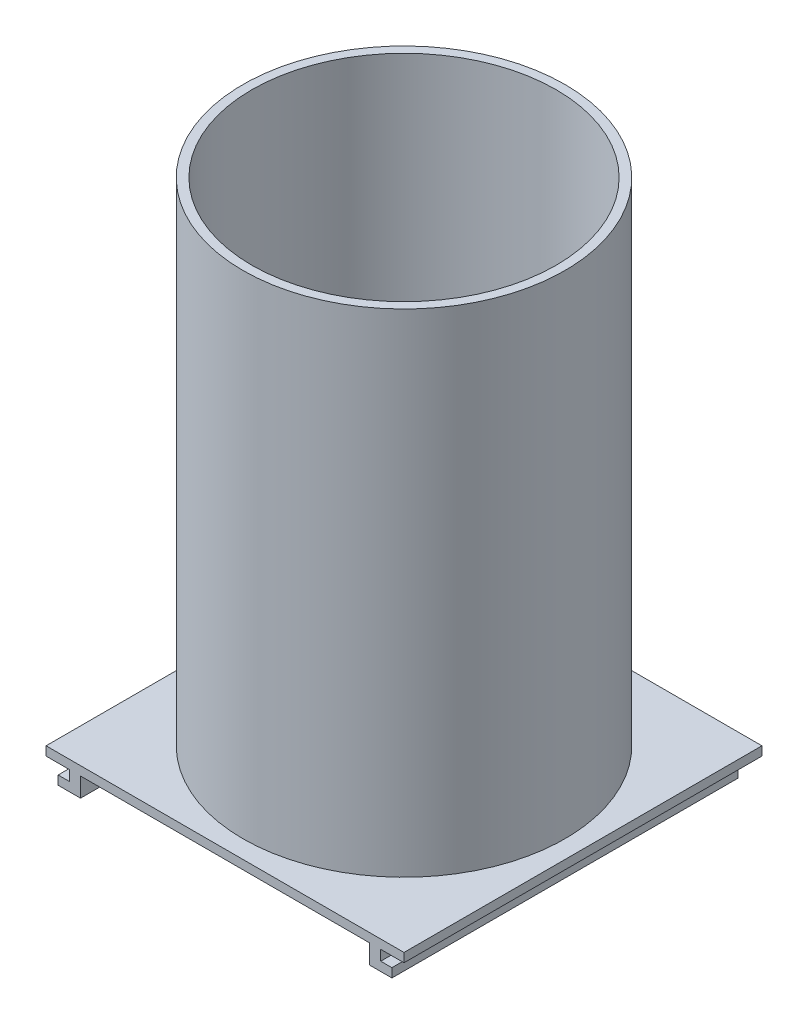
ISO-10303-21;
HEADER;
FILE_DESCRIPTION(('STEP AP214'),'2;1');
FILE_NAME('part.step','',(''),(''),'','','');
FILE_SCHEMA(('AUTOMOTIVE_DESIGN { 1 0 10303 214 1 1 1 1 }'));
ENDSEC;
DATA;
#1=APPLICATION_CONTEXT('core data for automotive mechanical design processes');
#2=APPLICATION_PROTOCOL_DEFINITION('international standard','automotive_design',2000,#1);
#3=PRODUCT_CONTEXT('',#1,'mechanical');
#4=PRODUCT('Part','Part','',(#3));
#5=PRODUCT_RELATED_PRODUCT_CATEGORY('part','',(#4));
#6=PRODUCT_DEFINITION_FORMATION('','',#4);
#7=PRODUCT_DEFINITION_CONTEXT('part definition',#1,'design');
#8=PRODUCT_DEFINITION('design','',#6,#7);
#9=PRODUCT_DEFINITION_SHAPE('','',#8);
#10=(LENGTH_UNIT() NAMED_UNIT(*) SI_UNIT(.MILLI.,.METRE.));
#11=(NAMED_UNIT(*) PLANE_ANGLE_UNIT() SI_UNIT($,.RADIAN.));
#12=(NAMED_UNIT(*) SI_UNIT($,.STERADIAN.) SOLID_ANGLE_UNIT());
#13=UNCERTAINTY_MEASURE_WITH_UNIT(LENGTH_MEASURE(1.E-05),#10,'distance_accuracy_value','');
#14=(GEOMETRIC_REPRESENTATION_CONTEXT(3) GLOBAL_UNCERTAINTY_ASSIGNED_CONTEXT((#13)) GLOBAL_UNIT_ASSIGNED_CONTEXT((#10,
#11,#12)) REPRESENTATION_CONTEXT('',''));
#15=CARTESIAN_POINT('',(0.,0.,0.));
#16=DIRECTION('',(0.,0.,1.));
#17=DIRECTION('',(1.,0.,0.));
#18=AXIS2_PLACEMENT_3D('',#15,#16,#17);
#19=CARTESIAN_POINT('',(0.,-2.,0.));
#20=DIRECTION('',(0.,1.,0.));
#21=DIRECTION('',(0.,0.,1.));
#22=AXIS2_PLACEMENT_3D('',#19,#20,#21);
#23=PLANE('',#22);
#24=CARTESIAN_POINT('',(0.,-2.,0.));
#25=DIRECTION('',(0.,1.,0.));
#26=DIRECTION('',(0.,0.,1.));
#27=AXIS2_PLACEMENT_3D('',#24,#25,#26);
#28=CIRCLE('',#27,34.);
#29=CARTESIAN_POINT('',(-32.3,-2.,10.6164965972773));
#30=VERTEX_POINT('',#29);
#31=CARTESIAN_POINT('',(32.3,-2.,10.6164965972773));
#32=VERTEX_POINT('',#31);
#33=EDGE_CURVE('E284',#30,#32,#28,.T.);
#34=ORIENTED_EDGE('',*,*,#33,.T.);
#35=DIRECTION('',(0.,0.,1.));
#36=VECTOR('',#35,1.);
#37=CARTESIAN_POINT('',(32.3,-1.99999999999999,-46.594694837519));
#38=LINE('',#37,#36);
#39=CARTESIAN_POINT('',(32.3,-2.,40.));
#40=VERTEX_POINT('',#39);
#41=EDGE_CURVE('E181',#32,#40,#38,.T.);
#42=ORIENTED_EDGE('',*,*,#41,.T.);
#43=DIRECTION('',(1.,0.,0.));
#44=VECTOR('',#43,1.);
#45=CARTESIAN_POINT('',(0.,-2.,40.));
#46=LINE('',#45,#44);
#47=CARTESIAN_POINT('',(-32.3,-2.,40.));
#48=VERTEX_POINT('',#47);
#49=EDGE_CURVE('E273',#48,#40,#46,.T.);
#50=ORIENTED_EDGE('',*,*,#49,.F.);
#51=DIRECTION('',(0.,0.,1.));
#52=VECTOR('',#51,1.);
#53=CARTESIAN_POINT('',(-32.3,-2.,-46.594694837519));
#54=LINE('',#53,#52);
#55=EDGE_CURVE('E12',#30,#48,#54,.T.);
#56=ORIENTED_EDGE('',*,*,#55,.F.);
#57=EDGE_LOOP('',(#34,#42,#50,#56));
#58=FACE_BOUND('',#57,.T.);
#59=ADVANCED_FACE('F37',(#58),#23,.F.);
#60=DIRECTION('',(1.,0.,0.));
#61=VECTOR('',#60,1.);
#62=CARTESIAN_POINT('',(34.8,-1.99999999999999,-37.35));
#63=LINE('',#62,#61);
#64=CARTESIAN_POINT('',(32.3,-2.,-37.35));
#65=VERTEX_POINT('',#64);
#66=CARTESIAN_POINT('',(34.8,-2.,-37.35));
#67=VERTEX_POINT('',#66);
#68=EDGE_CURVE('E60',#65,#67,#63,.T.);
#69=ORIENTED_EDGE('',*,*,#68,.F.);
#70=CARTESIAN_POINT('',(32.3,-1.99999999999999,-10.6164965972773));
#71=VERTEX_POINT('',#70);
#72=EDGE_CURVE('E195',#65,#71,#38,.T.);
#73=ORIENTED_EDGE('',*,*,#72,.T.);
#74=CARTESIAN_POINT('',(-32.3,-2.,-10.6164965972773));
#75=VERTEX_POINT('',#74);
#76=EDGE_CURVE('E281',#71,#75,#28,.T.);
#77=ORIENTED_EDGE('',*,*,#76,.T.);
#78=CARTESIAN_POINT('',(-32.3,-2.,-37.35));
#79=VERTEX_POINT('',#78);
#80=EDGE_CURVE('E48',#79,#75,#54,.T.);
#81=ORIENTED_EDGE('',*,*,#80,.F.);
#82=DIRECTION('',(-1.,0.,0.));
#83=VECTOR('',#82,1.);
#84=CARTESIAN_POINT('',(0.,-2.,-37.35));
#85=LINE('',#84,#83);
#86=CARTESIAN_POINT('',(-34.8,-2.,-37.35));
#87=VERTEX_POINT('',#86);
#88=EDGE_CURVE('E226',#79,#87,#85,.T.);
#89=ORIENTED_EDGE('',*,*,#88,.T.);
#90=DIRECTION('',(0.,0.,1.));
#91=VECTOR('',#90,1.);
#92=CARTESIAN_POINT('',(-34.8,-2.,-46.594694837519));
#93=LINE('',#92,#91);
#94=CARTESIAN_POINT('',(-34.8,-2.,40.));
#95=VERTEX_POINT('',#94);
#96=EDGE_CURVE('E247',#87,#95,#93,.T.);
#97=ORIENTED_EDGE('',*,*,#96,.T.);
#98=CARTESIAN_POINT('',(-40.,-2.,40.));
#99=VERTEX_POINT('',#98);
#100=EDGE_CURVE('E269',#99,#95,#46,.T.);
#101=ORIENTED_EDGE('',*,*,#100,.F.);
#102=DIRECTION('',(0.,0.,-1.));
#103=VECTOR('',#102,1.);
#104=CARTESIAN_POINT('',(-40.,-2.,0.));
#105=LINE('',#104,#103);
#106=CARTESIAN_POINT('',(-40.,-2.,-40.));
#107=VERTEX_POINT('',#106);
#108=EDGE_CURVE('E279',#99,#107,#105,.T.);
#109=ORIENTED_EDGE('',*,*,#108,.T.);
#110=DIRECTION('',(1.,0.,0.));
#111=VECTOR('',#110,1.);
#112=CARTESIAN_POINT('',(0.,-2.,-40.));
#113=LINE('',#112,#111);
#114=CARTESIAN_POINT('',(40.,-2.,-40.));
#115=VERTEX_POINT('',#114);
#116=EDGE_CURVE('E277',#107,#115,#113,.T.);
#117=ORIENTED_EDGE('',*,*,#116,.T.);
#118=DIRECTION('',(0.,0.,-1.));
#119=VECTOR('',#118,1.);
#120=CARTESIAN_POINT('',(40.,-2.,0.));
#121=LINE('',#120,#119);
#122=CARTESIAN_POINT('',(40.,-2.,40.));
#123=VERTEX_POINT('',#122);
#124=EDGE_CURVE('E272',#123,#115,#121,.T.);
#125=ORIENTED_EDGE('',*,*,#124,.F.);
#126=CARTESIAN_POINT('',(34.8,-2.,40.));
#127=VERTEX_POINT('',#126);
#128=EDGE_CURVE('E274',#127,#123,#46,.T.);
#129=ORIENTED_EDGE('',*,*,#128,.F.);
#130=DIRECTION('',(0.,0.,1.));
#131=VECTOR('',#130,1.);
#132=CARTESIAN_POINT('',(34.8,-1.99999999999999,-46.594694837519));
#133=LINE('',#132,#131);
#134=EDGE_CURVE('E56',#67,#127,#133,.T.);
#135=ORIENTED_EDGE('',*,*,#134,.F.);
#136=EDGE_LOOP('',(#69,#73,#77,#81,#89,#97,#101,#109,#117,#125,#129,#135));
#137=FACE_BOUND('',#136,.T.);
#138=ADVANCED_FACE('F318',(#137),#23,.F.);
#139=CARTESIAN_POINT('',(0.,-2.,40.));
#140=DIRECTION('',(0.,0.,1.));
#141=DIRECTION('',(1.,0.,0.));
#142=AXIS2_PLACEMENT_3D('',#139,#140,#141);
#143=PLANE('',#142);
#144=DIRECTION('',(1.,0.,0.));
#145=VECTOR('',#144,1.);
#146=CARTESIAN_POINT('',(0.,0.,40.));
#147=LINE('',#146,#145);
#148=CARTESIAN_POINT('',(-40.,0.,40.));
#149=VERTEX_POINT('',#148);
#150=CARTESIAN_POINT('',(40.,0.,40.));
#151=VERTEX_POINT('',#150);
#152=EDGE_CURVE('E266',#149,#151,#147,.T.);
#153=ORIENTED_EDGE('',*,*,#152,.F.);
#154=DIRECTION('',(0.,1.,0.));
#155=VECTOR('',#154,1.);
#156=CARTESIAN_POINT('',(-40.,-2.,40.));
#157=LINE('',#156,#155);
#158=EDGE_CURVE('E46',#99,#149,#157,.T.);
#159=ORIENTED_EDGE('',*,*,#158,.F.);
#160=ORIENTED_EDGE('',*,*,#100,.T.);
#161=DIRECTION('',(0.,1.,0.));
#162=VECTOR('',#161,1.);
#163=CARTESIAN_POINT('',(-34.8,0.,40.));
#164=LINE('',#163,#162);
#165=CARTESIAN_POINT('',(-34.8,-4.3,40.));
#166=VERTEX_POINT('',#165);
#167=EDGE_CURVE('E210',#166,#95,#164,.T.);
#168=ORIENTED_EDGE('',*,*,#167,.F.);
#169=DIRECTION('',(1.,0.,0.));
#170=VECTOR('',#169,1.);
#171=CARTESIAN_POINT('',(0.,-4.3,40.));
#172=LINE('',#171,#170);
#173=CARTESIAN_POINT('',(-37.3,-4.3,40.));
#174=VERTEX_POINT('',#173);
#175=EDGE_CURVE('E234',#174,#166,#172,.T.);
#176=ORIENTED_EDGE('',*,*,#175,.F.);
#177=DIRECTION('',(0.,1.,0.));
#178=VECTOR('',#177,1.);
#179=CARTESIAN_POINT('',(-37.3,0.,40.));
#180=LINE('',#179,#178);
#181=CARTESIAN_POINT('',(-37.3,-6.3,40.));
#182=VERTEX_POINT('',#181);
#183=EDGE_CURVE('E237',#182,#174,#180,.T.);
#184=ORIENTED_EDGE('',*,*,#183,.F.);
#185=DIRECTION('',(-1.,0.,0.));
#186=VECTOR('',#185,1.);
#187=CARTESIAN_POINT('',(0.,-6.29999999999999,40.));
#188=LINE('',#187,#186);
#189=CARTESIAN_POINT('',(-32.3,-6.3,40.));
#190=VERTEX_POINT('',#189);
#191=EDGE_CURVE('E240',#190,#182,#188,.T.);
#192=ORIENTED_EDGE('',*,*,#191,.F.);
#193=DIRECTION('',(0.,-1.,0.));
#194=VECTOR('',#193,1.);
#195=CARTESIAN_POINT('',(-32.3,0.,40.));
#196=LINE('',#195,#194);
#197=EDGE_CURVE('E243',#48,#190,#196,.T.);
#198=ORIENTED_EDGE('',*,*,#197,.F.);
#199=ORIENTED_EDGE('',*,*,#49,.T.);
#200=DIRECTION('',(0.,-1.,0.));
#201=VECTOR('',#200,1.);
#202=CARTESIAN_POINT('',(32.3,-1.99999999999999,40.));
#203=LINE('',#202,#201);
#204=CARTESIAN_POINT('',(32.3,-6.29999999999999,40.));
#205=VERTEX_POINT('',#204);
#206=EDGE_CURVE('E207',#40,#205,#203,.T.);
#207=ORIENTED_EDGE('',*,*,#206,.T.);
#208=DIRECTION('',(1.,0.,0.));
#209=VECTOR('',#208,1.);
#210=CARTESIAN_POINT('',(32.3,-6.29999999999999,40.));
#211=LINE('',#210,#209);
#212=CARTESIAN_POINT('',(37.3,-6.3,40.));
#213=VERTEX_POINT('',#212);
#214=EDGE_CURVE('E204',#205,#213,#211,.T.);
#215=ORIENTED_EDGE('',*,*,#214,.T.);
#216=DIRECTION('',(0.,1.,0.));
#217=VECTOR('',#216,1.);
#218=CARTESIAN_POINT('',(37.3,-6.3,40.));
#219=LINE('',#218,#217);
#220=CARTESIAN_POINT('',(37.3,-4.3,40.));
#221=VERTEX_POINT('',#220);
#222=EDGE_CURVE('E202',#213,#221,#219,.T.);
#223=ORIENTED_EDGE('',*,*,#222,.T.);
#224=DIRECTION('',(-1.,0.,0.));
#225=VECTOR('',#224,1.);
#226=CARTESIAN_POINT('',(37.3,-4.3,40.));
#227=LINE('',#226,#225);
#228=CARTESIAN_POINT('',(34.8,-4.29999999999999,40.));
#229=VERTEX_POINT('',#228);
#230=EDGE_CURVE('E185',#221,#229,#227,.T.);
#231=ORIENTED_EDGE('',*,*,#230,.T.);
#232=DIRECTION('',(0.,1.,0.));
#233=VECTOR('',#232,1.);
#234=CARTESIAN_POINT('',(34.8,-4.29999999999999,40.));
#235=LINE('',#234,#233);
#236=EDGE_CURVE('E198',#229,#127,#235,.T.);
#237=ORIENTED_EDGE('',*,*,#236,.T.);
#238=ORIENTED_EDGE('',*,*,#128,.T.);
#239=DIRECTION('',(0.,1.,0.));
#240=VECTOR('',#239,1.);
#241=CARTESIAN_POINT('',(40.,-2.,40.));
#242=LINE('',#241,#240);
#243=EDGE_CURVE('E41',#123,#151,#242,.T.);
#244=ORIENTED_EDGE('',*,*,#243,.T.);
#245=EDGE_LOOP('',(#153,#159,#160,#168,#176,#184,#192,#198,#199,#207,#215,#223,#231,#237,#238,#244));
#246=FACE_BOUND('',#245,.T.);
#247=ADVANCED_FACE('F39',(#246),#143,.T.);
#248=CARTESIAN_POINT('',(-40.,-2.,0.));
#249=DIRECTION('',(1.,0.,0.));
#250=DIRECTION('',(0.,0.,-1.));
#251=AXIS2_PLACEMENT_3D('',#248,#249,#250);
#252=PLANE('',#251);
#253=DIRECTION('',(0.,0.,-1.));
#254=VECTOR('',#253,1.);
#255=CARTESIAN_POINT('',(-40.,0.,0.));
#256=LINE('',#255,#254);
#257=CARTESIAN_POINT('',(-40.,0.,-40.));
#258=VERTEX_POINT('',#257);
#259=EDGE_CURVE('E293',#149,#258,#256,.T.);
#260=ORIENTED_EDGE('',*,*,#259,.T.);
#261=DIRECTION('',(0.,1.,0.));
#262=VECTOR('',#261,1.);
#263=CARTESIAN_POINT('',(-40.,-2.,-40.));
#264=LINE('',#263,#262);
#265=EDGE_CURVE('E296',#107,#258,#264,.T.);
#266=ORIENTED_EDGE('',*,*,#265,.F.);
#267=ORIENTED_EDGE('',*,*,#108,.F.);
#268=ORIENTED_EDGE('',*,*,#158,.T.);
#269=EDGE_LOOP('',(#260,#266,#267,#268));
#270=FACE_BOUND('',#269,.T.);
#271=ADVANCED_FACE('F313',(#270),#252,.F.);
#272=CARTESIAN_POINT('',(0.,-2.,-40.));
#273=DIRECTION('',(0.,0.,1.));
#274=DIRECTION('',(1.,0.,0.));
#275=AXIS2_PLACEMENT_3D('',#272,#273,#274);
#276=PLANE('',#275);
#277=DIRECTION('',(1.,0.,0.));
#278=VECTOR('',#277,1.);
#279=CARTESIAN_POINT('',(0.,0.,-40.));
#280=LINE('',#279,#278);
#281=CARTESIAN_POINT('',(40.,0.,-40.));
#282=VERTEX_POINT('',#281);
#283=EDGE_CURVE('E290',#258,#282,#280,.T.);
#284=ORIENTED_EDGE('',*,*,#283,.T.);
#285=DIRECTION('',(0.,1.,0.));
#286=VECTOR('',#285,1.);
#287=CARTESIAN_POINT('',(40.,-2.,-40.));
#288=LINE('',#287,#286);
#289=EDGE_CURVE('E298',#115,#282,#288,.T.);
#290=ORIENTED_EDGE('',*,*,#289,.F.);
#291=ORIENTED_EDGE('',*,*,#116,.F.);
#292=ORIENTED_EDGE('',*,*,#265,.T.);
#293=EDGE_LOOP('',(#284,#290,#291,#292));
#294=FACE_BOUND('',#293,.T.);
#295=ADVANCED_FACE('F317',(#294),#276,.F.);
#296=CARTESIAN_POINT('',(40.,-2.,0.));
#297=DIRECTION('',(1.,0.,0.));
#298=DIRECTION('',(0.,0.,-1.));
#299=AXIS2_PLACEMENT_3D('',#296,#297,#298);
#300=PLANE('',#299);
#301=DIRECTION('',(0.,0.,-1.));
#302=VECTOR('',#301,1.);
#303=CARTESIAN_POINT('',(40.,0.,0.));
#304=LINE('',#303,#302);
#305=EDGE_CURVE('E287',#151,#282,#304,.T.);
#306=ORIENTED_EDGE('',*,*,#305,.F.);
#307=ORIENTED_EDGE('',*,*,#243,.F.);
#308=ORIENTED_EDGE('',*,*,#124,.T.);
#309=ORIENTED_EDGE('',*,*,#289,.T.);
#310=EDGE_LOOP('',(#306,#307,#308,#309));
#311=FACE_BOUND('',#310,.T.);
#312=ADVANCED_FACE('F306',(#311),#300,.T.);
#313=CARTESIAN_POINT('',(0.,-2.,0.));
#314=DIRECTION('',(0.,1.,0.));
#315=DIRECTION('',(0.,0.,1.));
#316=AXIS2_PLACEMENT_3D('',#313,#314,#315);
#317=CYLINDRICAL_SURFACE('',#316,34.);
#318=EDGE_CURVE('E282',#75,#30,#28,.T.);
#319=ORIENTED_EDGE('',*,*,#318,.F.);
#320=ORIENTED_EDGE('',*,*,#76,.F.);
#321=EDGE_CURVE('E354',#32,#71,#28,.T.);
#322=ORIENTED_EDGE('',*,*,#321,.F.);
#323=ORIENTED_EDGE('',*,*,#33,.F.);
#324=EDGE_LOOP('',(#319,#320,#322,#323));
#325=FACE_BOUND('',#324,.T.);
#326=CARTESIAN_POINT('',(0.,110.,0.));
#327=DIRECTION('',(0.,1.,0.));
#328=DIRECTION('',(0.,0.,1.));
#329=AXIS2_PLACEMENT_3D('',#326,#327,#328);
#330=CIRCLE('',#329,34.);
#331=CARTESIAN_POINT('',(0.,110.,34.));
#332=VERTEX_POINT('',#331);
#333=EDGE_CURVE('E260',#332,#332,#330,.T.);
#334=ORIENTED_EDGE('',*,*,#333,.T.);
#335=EDGE_LOOP('',(#334));
#336=FACE_BOUND('',#335,.T.);
#337=ADVANCED_FACE('F351',(#325,#336),#317,.F.);
#338=CARTESIAN_POINT('',(0.,0.,0.));
#339=DIRECTION('',(0.,1.,0.));
#340=DIRECTION('',(0.,0.,1.));
#341=AXIS2_PLACEMENT_3D('',#338,#339,#340);
#342=PLANE('',#341);
#343=CARTESIAN_POINT('',(0.,0.,0.));
#344=DIRECTION('',(0.,1.,0.));
#345=DIRECTION('',(0.,0.,1.));
#346=AXIS2_PLACEMENT_3D('',#343,#344,#345);
#347=CIRCLE('',#346,36.);
#348=CARTESIAN_POINT('',(0.,0.,36.));
#349=VERTEX_POINT('',#348);
#350=EDGE_CURVE('E232',#349,#349,#347,.T.);
#351=ORIENTED_EDGE('',*,*,#350,.F.);
#352=EDGE_LOOP('',(#351));
#353=FACE_BOUND('',#352,.T.);
#354=ORIENTED_EDGE('',*,*,#152,.T.);
#355=ORIENTED_EDGE('',*,*,#305,.T.);
#356=ORIENTED_EDGE('',*,*,#283,.F.);
#357=ORIENTED_EDGE('',*,*,#259,.F.);
#358=EDGE_LOOP('',(#354,#355,#356,#357));
#359=FACE_BOUND('',#358,.T.);
#360=ADVANCED_FACE('F310',(#353,#359),#342,.T.);
#361=CARTESIAN_POINT('',(0.,110.,0.));
#362=DIRECTION('',(0.,-1.,0.));
#363=DIRECTION('',(0.,0.,-1.));
#364=AXIS2_PLACEMENT_3D('',#361,#362,#363);
#365=CYLINDRICAL_SURFACE('',#364,36.);
#366=CARTESIAN_POINT('',(0.,110.,0.));
#367=DIRECTION('',(0.,1.,0.));
#368=DIRECTION('',(0.,0.,1.));
#369=AXIS2_PLACEMENT_3D('',#366,#367,#368);
#370=CIRCLE('',#369,36.);
#371=CARTESIAN_POINT('',(0.,110.,36.));
#372=VERTEX_POINT('',#371);
#373=EDGE_CURVE('E263',#372,#372,#370,.T.);
#374=ORIENTED_EDGE('',*,*,#373,.F.);
#375=EDGE_LOOP('',(#374));
#376=FACE_BOUND('',#375,.T.);
#377=ORIENTED_EDGE('',*,*,#350,.T.);
#378=EDGE_LOOP('',(#377));
#379=FACE_BOUND('',#378,.T.);
#380=ADVANCED_FACE('F383',(#376,#379),#365,.T.);
#381=CARTESIAN_POINT('',(0.,110.,0.));
#382=DIRECTION('',(0.,1.,0.));
#383=DIRECTION('',(0.,0.,1.));
#384=AXIS2_PLACEMENT_3D('',#381,#382,#383);
#385=PLANE('',#384);
#386=ORIENTED_EDGE('',*,*,#333,.F.);
#387=EDGE_LOOP('',(#386));
#388=FACE_BOUND('',#387,.T.);
#389=ORIENTED_EDGE('',*,*,#373,.T.);
#390=EDGE_LOOP('',(#389));
#391=FACE_BOUND('',#390,.T.);
#392=ADVANCED_FACE('F414',(#388,#391),#385,.T.);
#393=CARTESIAN_POINT('',(0.,-2.,-46.594694837519));
#394=DIRECTION('',(0.,-1.,0.));
#395=DIRECTION('',(0.,0.,-1.));
#396=AXIS2_PLACEMENT_3D('',#393,#394,#395);
#397=PLANE('',#396);
#398=EDGE_CURVE('E49',#75,#30,#54,.T.);
#399=ORIENTED_EDGE('',*,*,#398,.F.);
#400=ORIENTED_EDGE('',*,*,#318,.T.);
#401=EDGE_LOOP('',(#399,#400));
#402=FACE_BOUND('',#401,.T.);
#403=ADVANCED_FACE('F361',(#402),#397,.F.);
#404=CARTESIAN_POINT('',(0.,-4.3,-46.594694837519));
#405=DIRECTION('',(0.,-1.,0.));
#406=DIRECTION('',(0.,0.,-1.));
#407=AXIS2_PLACEMENT_3D('',#404,#405,#406);
#408=PLANE('',#407);
#409=DIRECTION('',(0.,0.,1.));
#410=VECTOR('',#409,1.);
#411=CARTESIAN_POINT('',(-34.8,-4.3,-46.594694837519));
#412=LINE('',#411,#410);
#413=CARTESIAN_POINT('',(-34.8,-4.3,-37.35));
#414=VERTEX_POINT('',#413);
#415=EDGE_CURVE('E246',#414,#166,#412,.T.);
#416=ORIENTED_EDGE('',*,*,#415,.F.);
#417=DIRECTION('',(-1.,0.,0.));
#418=VECTOR('',#417,1.);
#419=CARTESIAN_POINT('',(0.,-4.3,-37.35));
#420=LINE('',#419,#418);
#421=CARTESIAN_POINT('',(-37.3,-4.3,-37.35));
#422=VERTEX_POINT('',#421);
#423=EDGE_CURVE('E220',#414,#422,#420,.T.);
#424=ORIENTED_EDGE('',*,*,#423,.T.);
#425=DIRECTION('',(0.,0.,1.));
#426=VECTOR('',#425,1.);
#427=CARTESIAN_POINT('',(-37.3,-4.3,-46.594694837519));
#428=LINE('',#427,#426);
#429=EDGE_CURVE('E255',#422,#174,#428,.T.);
#430=ORIENTED_EDGE('',*,*,#429,.T.);
#431=ORIENTED_EDGE('',*,*,#175,.T.);
#432=EDGE_LOOP('',(#416,#424,#430,#431));
#433=FACE_BOUND('',#432,.T.);
#434=ADVANCED_FACE('F328',(#433),#408,.F.);
#435=CARTESIAN_POINT('',(-37.3,0.,-46.594694837519));
#436=DIRECTION('',(1.,0.,0.));
#437=DIRECTION('',(0.,0.,-1.));
#438=AXIS2_PLACEMENT_3D('',#435,#436,#437);
#439=PLANE('',#438);
#440=ORIENTED_EDGE('',*,*,#429,.F.);
#441=DIRECTION('',(0.,-1.,0.));
#442=VECTOR('',#441,1.);
#443=CARTESIAN_POINT('',(-37.3,0.,-37.35));
#444=LINE('',#443,#442);
#445=CARTESIAN_POINT('',(-37.3,-6.3,-37.35));
#446=VERTEX_POINT('',#445);
#447=EDGE_CURVE('E216',#422,#446,#444,.T.);
#448=ORIENTED_EDGE('',*,*,#447,.T.);
#449=DIRECTION('',(0.,0.,1.));
#450=VECTOR('',#449,1.);
#451=CARTESIAN_POINT('',(-37.3,-6.3,-46.594694837519));
#452=LINE('',#451,#450);
#453=EDGE_CURVE('E253',#446,#182,#452,.T.);
#454=ORIENTED_EDGE('',*,*,#453,.T.);
#455=ORIENTED_EDGE('',*,*,#183,.T.);
#456=EDGE_LOOP('',(#440,#448,#454,#455));
#457=FACE_BOUND('',#456,.T.);
#458=ADVANCED_FACE('F331',(#457),#439,.F.);
#459=CARTESIAN_POINT('',(0.,-6.29999999999999,-46.594694837519));
#460=DIRECTION('',(0.,1.,0.));
#461=DIRECTION('',(-1.,0.,0.));
#462=AXIS2_PLACEMENT_3D('',#459,#460,#461);
#463=PLANE('',#462);
#464=ORIENTED_EDGE('',*,*,#453,.F.);
#465=DIRECTION('',(1.,0.,0.));
#466=VECTOR('',#465,1.);
#467=CARTESIAN_POINT('',(0.,-6.29999999999999,-37.35));
#468=LINE('',#467,#466);
#469=CARTESIAN_POINT('',(-32.3,-6.3,-37.35));
#470=VERTEX_POINT('',#469);
#471=EDGE_CURVE('E219',#446,#470,#468,.T.);
#472=ORIENTED_EDGE('',*,*,#471,.T.);
#473=DIRECTION('',(0.,0.,1.));
#474=VECTOR('',#473,1.);
#475=CARTESIAN_POINT('',(-32.3,-6.3,-46.594694837519));
#476=LINE('',#475,#474);
#477=EDGE_CURVE('E251',#470,#190,#476,.T.);
#478=ORIENTED_EDGE('',*,*,#477,.T.);
#479=ORIENTED_EDGE('',*,*,#191,.T.);
#480=EDGE_LOOP('',(#464,#472,#478,#479));
#481=FACE_BOUND('',#480,.T.);
#482=ADVANCED_FACE('F338',(#481),#463,.F.);
#483=CARTESIAN_POINT('',(-32.3,0.,-46.594694837519));
#484=DIRECTION('',(-1.,0.,0.));
#485=DIRECTION('',(0.,0.,1.));
#486=AXIS2_PLACEMENT_3D('',#483,#484,#485);
#487=PLANE('',#486);
#488=ORIENTED_EDGE('',*,*,#477,.F.);
#489=DIRECTION('',(0.,1.,0.));
#490=VECTOR('',#489,1.);
#491=CARTESIAN_POINT('',(-32.3,0.,-37.35));
#492=LINE('',#491,#490);
#493=EDGE_CURVE('E223',#470,#79,#492,.T.);
#494=ORIENTED_EDGE('',*,*,#493,.T.);
#495=ORIENTED_EDGE('',*,*,#80,.T.);
#496=ORIENTED_EDGE('',*,*,#398,.T.);
#497=ORIENTED_EDGE('',*,*,#55,.T.);
#498=ORIENTED_EDGE('',*,*,#197,.T.);
#499=EDGE_LOOP('',(#488,#494,#495,#496,#497,#498));
#500=FACE_BOUND('',#499,.T.);
#501=ADVANCED_FACE('F341',(#500),#487,.F.);
#502=CARTESIAN_POINT('',(-34.8,0.,-46.594694837519));
#503=DIRECTION('',(1.,0.,0.));
#504=DIRECTION('',(0.,0.,-1.));
#505=AXIS2_PLACEMENT_3D('',#502,#503,#504);
#506=PLANE('',#505);
#507=ORIENTED_EDGE('',*,*,#96,.F.);
#508=DIRECTION('',(0.,-1.,0.));
#509=VECTOR('',#508,1.);
#510=CARTESIAN_POINT('',(-34.8,0.,-37.35));
#511=LINE('',#510,#509);
#512=EDGE_CURVE('E229',#87,#414,#511,.T.);
#513=ORIENTED_EDGE('',*,*,#512,.T.);
#514=ORIENTED_EDGE('',*,*,#415,.T.);
#515=ORIENTED_EDGE('',*,*,#167,.T.);
#516=EDGE_LOOP('',(#507,#513,#514,#515));
#517=FACE_BOUND('',#516,.T.);
#518=ADVANCED_FACE('F325',(#517),#506,.F.);
#519=CARTESIAN_POINT('',(0.,-2.,-37.35));
#520=DIRECTION('',(0.,0.,1.));
#521=DIRECTION('',(1.,0.,0.));
#522=AXIS2_PLACEMENT_3D('',#519,#520,#521);
#523=PLANE('',#522);
#524=ORIENTED_EDGE('',*,*,#88,.F.);
#525=ORIENTED_EDGE('',*,*,#493,.F.);
#526=ORIENTED_EDGE('',*,*,#471,.F.);
#527=ORIENTED_EDGE('',*,*,#447,.F.);
#528=ORIENTED_EDGE('',*,*,#423,.F.);
#529=ORIENTED_EDGE('',*,*,#512,.F.);
#530=EDGE_LOOP('',(#524,#525,#526,#527,#528,#529));
#531=FACE_BOUND('',#530,.T.);
#532=ADVANCED_FACE('F363',(#531),#523,.F.);
#533=CARTESIAN_POINT('',(34.8,-1.99999999999999,-46.594694837519));
#534=DIRECTION('',(0.,1.,0.));
#535=DIRECTION('',(-1.,0.,0.));
#536=AXIS2_PLACEMENT_3D('',#533,#534,#535);
#537=PLANE('',#536);
#538=ORIENTED_EDGE('',*,*,#321,.T.);
#539=EDGE_CURVE('E197',#71,#32,#38,.T.);
#540=ORIENTED_EDGE('',*,*,#539,.T.);
#541=EDGE_LOOP('',(#538,#540));
#542=FACE_BOUND('',#541,.T.);
#543=ADVANCED_FACE('F365',(#542),#537,.T.);
#544=CARTESIAN_POINT('',(32.3,-1.99999999999999,-46.594694837519));
#545=DIRECTION('',(-1.,0.,0.));
#546=DIRECTION('',(0.,0.,1.));
#547=AXIS2_PLACEMENT_3D('',#544,#545,#546);
#548=PLANE('',#547);
#549=DIRECTION('',(0.,1.,0.));
#550=VECTOR('',#549,1.);
#551=CARTESIAN_POINT('',(32.3,-1.99999999999999,-37.35));
#552=LINE('',#551,#550);
#553=CARTESIAN_POINT('',(32.3,-6.29999999999999,-37.35));
#554=VERTEX_POINT('',#553);
#555=EDGE_CURVE('E211',#554,#65,#552,.T.);
#556=ORIENTED_EDGE('',*,*,#555,.F.);
#557=DIRECTION('',(0.,0.,1.));
#558=VECTOR('',#557,1.);
#559=CARTESIAN_POINT('',(32.3,-6.29999999999999,-46.594694837519));
#560=LINE('',#559,#558);
#561=EDGE_CURVE('E189',#554,#205,#560,.T.);
#562=ORIENTED_EDGE('',*,*,#561,.T.);
#563=ORIENTED_EDGE('',*,*,#206,.F.);
#564=ORIENTED_EDGE('',*,*,#41,.F.);
#565=ORIENTED_EDGE('',*,*,#539,.F.);
#566=ORIENTED_EDGE('',*,*,#72,.F.);
#567=EDGE_LOOP('',(#556,#562,#563,#564,#565,#566));
#568=FACE_BOUND('',#567,.T.);
#569=ADVANCED_FACE('F371',(#568),#548,.T.);
#570=CARTESIAN_POINT('',(34.8,-4.29999999999999,-46.594694837519));
#571=DIRECTION('',(1.,0.,0.));
#572=DIRECTION('',(0.,0.,-1.));
#573=AXIS2_PLACEMENT_3D('',#570,#571,#572);
#574=PLANE('',#573);
#575=DIRECTION('',(0.,-1.,0.));
#576=VECTOR('',#575,1.);
#577=CARTESIAN_POINT('',(34.8,-4.29999999999999,-37.35));
#578=LINE('',#577,#576);
#579=CARTESIAN_POINT('',(34.8,-4.29999999999999,-37.35));
#580=VERTEX_POINT('',#579);
#581=EDGE_CURVE('E169',#67,#580,#578,.T.);
#582=ORIENTED_EDGE('',*,*,#581,.F.);
#583=ORIENTED_EDGE('',*,*,#134,.T.);
#584=ORIENTED_EDGE('',*,*,#236,.F.);
#585=DIRECTION('',(0.,0.,1.));
#586=VECTOR('',#585,1.);
#587=CARTESIAN_POINT('',(34.8,-4.29999999999999,-46.594694837519));
#588=LINE('',#587,#586);
#589=EDGE_CURVE('E187',#580,#229,#588,.T.);
#590=ORIENTED_EDGE('',*,*,#589,.F.);
#591=EDGE_LOOP('',(#582,#583,#584,#590));
#592=FACE_BOUND('',#591,.T.);
#593=ADVANCED_FACE('F472',(#592),#574,.T.);
#594=CARTESIAN_POINT('',(37.3,-4.3,-46.594694837519));
#595=DIRECTION('',(0.,1.,0.));
#596=DIRECTION('',(-1.,0.,0.));
#597=AXIS2_PLACEMENT_3D('',#594,#595,#596);
#598=PLANE('',#597);
#599=DIRECTION('',(1.,0.,0.));
#600=VECTOR('',#599,1.);
#601=CARTESIAN_POINT('',(37.3,-4.3,-37.35));
#602=LINE('',#601,#600);
#603=CARTESIAN_POINT('',(37.3,-4.3,-37.35));
#604=VERTEX_POINT('',#603);
#605=EDGE_CURVE('E163',#580,#604,#602,.T.);
#606=ORIENTED_EDGE('',*,*,#605,.F.);
#607=ORIENTED_EDGE('',*,*,#589,.T.);
#608=ORIENTED_EDGE('',*,*,#230,.F.);
#609=DIRECTION('',(0.,0.,1.));
#610=VECTOR('',#609,1.);
#611=CARTESIAN_POINT('',(37.3,-4.3,-46.594694837519));
#612=LINE('',#611,#610);
#613=EDGE_CURVE('E177',#604,#221,#612,.T.);
#614=ORIENTED_EDGE('',*,*,#613,.F.);
#615=EDGE_LOOP('',(#606,#607,#608,#614));
#616=FACE_BOUND('',#615,.T.);
#617=ADVANCED_FACE('F183',(#616),#598,.T.);
#618=CARTESIAN_POINT('',(37.3,-6.3,-46.594694837519));
#619=DIRECTION('',(1.,0.,0.));
#620=DIRECTION('',(0.,0.,-1.));
#621=AXIS2_PLACEMENT_3D('',#618,#619,#620);
#622=PLANE('',#621);
#623=DIRECTION('',(0.,-1.,0.));
#624=VECTOR('',#623,1.);
#625=CARTESIAN_POINT('',(37.3,-6.3,-37.35));
#626=LINE('',#625,#624);
#627=CARTESIAN_POINT('',(37.3,-6.3,-37.35));
#628=VERTEX_POINT('',#627);
#629=EDGE_CURVE('E166',#604,#628,#626,.T.);
#630=ORIENTED_EDGE('',*,*,#629,.F.);
#631=ORIENTED_EDGE('',*,*,#613,.T.);
#632=ORIENTED_EDGE('',*,*,#222,.F.);
#633=DIRECTION('',(0.,0.,1.));
#634=VECTOR('',#633,1.);
#635=CARTESIAN_POINT('',(37.3,-6.3,-46.594694837519));
#636=LINE('',#635,#634);
#637=EDGE_CURVE('E179',#628,#213,#636,.T.);
#638=ORIENTED_EDGE('',*,*,#637,.F.);
#639=EDGE_LOOP('',(#630,#631,#632,#638));
#640=FACE_BOUND('',#639,.T.);
#641=ADVANCED_FACE('F175',(#640),#622,.T.);
#642=CARTESIAN_POINT('',(32.3,-6.29999999999999,-46.594694837519));
#643=DIRECTION('',(0.,-1.,0.));
#644=DIRECTION('',(1.,0.,0.));
#645=AXIS2_PLACEMENT_3D('',#642,#643,#644);
#646=PLANE('',#645);
#647=DIRECTION('',(-1.,0.,0.));
#648=VECTOR('',#647,1.);
#649=CARTESIAN_POINT('',(32.3,-6.29999999999999,-37.35));
#650=LINE('',#649,#648);
#651=EDGE_CURVE('E213',#628,#554,#650,.T.);
#652=ORIENTED_EDGE('',*,*,#651,.F.);
#653=ORIENTED_EDGE('',*,*,#637,.T.);
#654=ORIENTED_EDGE('',*,*,#214,.F.);
#655=ORIENTED_EDGE('',*,*,#561,.F.);
#656=EDGE_LOOP('',(#652,#653,#654,#655));
#657=FACE_BOUND('',#656,.T.);
#658=ADVANCED_FACE('F499',(#657),#646,.T.);
#659=CARTESIAN_POINT('',(0.,-2.,-37.35));
#660=DIRECTION('',(0.,0.,1.));
#661=DIRECTION('',(1.,0.,0.));
#662=AXIS2_PLACEMENT_3D('',#659,#660,#661);
#663=PLANE('',#662);
#664=ORIENTED_EDGE('',*,*,#555,.T.);
#665=ORIENTED_EDGE('',*,*,#68,.T.);
#666=ORIENTED_EDGE('',*,*,#581,.T.);
#667=ORIENTED_EDGE('',*,*,#605,.T.);
#668=ORIENTED_EDGE('',*,*,#629,.T.);
#669=ORIENTED_EDGE('',*,*,#651,.T.);
#670=EDGE_LOOP('',(#664,#665,#666,#667,#668,#669));
#671=FACE_BOUND('',#670,.T.);
#672=ADVANCED_FACE('F165',(#671),#663,.F.);
#673=CLOSED_SHELL('',(#59,#138,#247,#271,#295,#312,#337,#360,#380,#392,#403,#434,#458,#482,#501,
#518,#532,#543,#569,#593,#617,#641,#658,#672));
#674=MANIFOLD_SOLID_BREP('B2',#673);
#675=ADVANCED_BREP_SHAPE_REPRESENTATION('',(#18,#674),#14);
#676=SHAPE_DEFINITION_REPRESENTATION(#9,#675);
ENDSEC;
END-ISO-10303-21;
